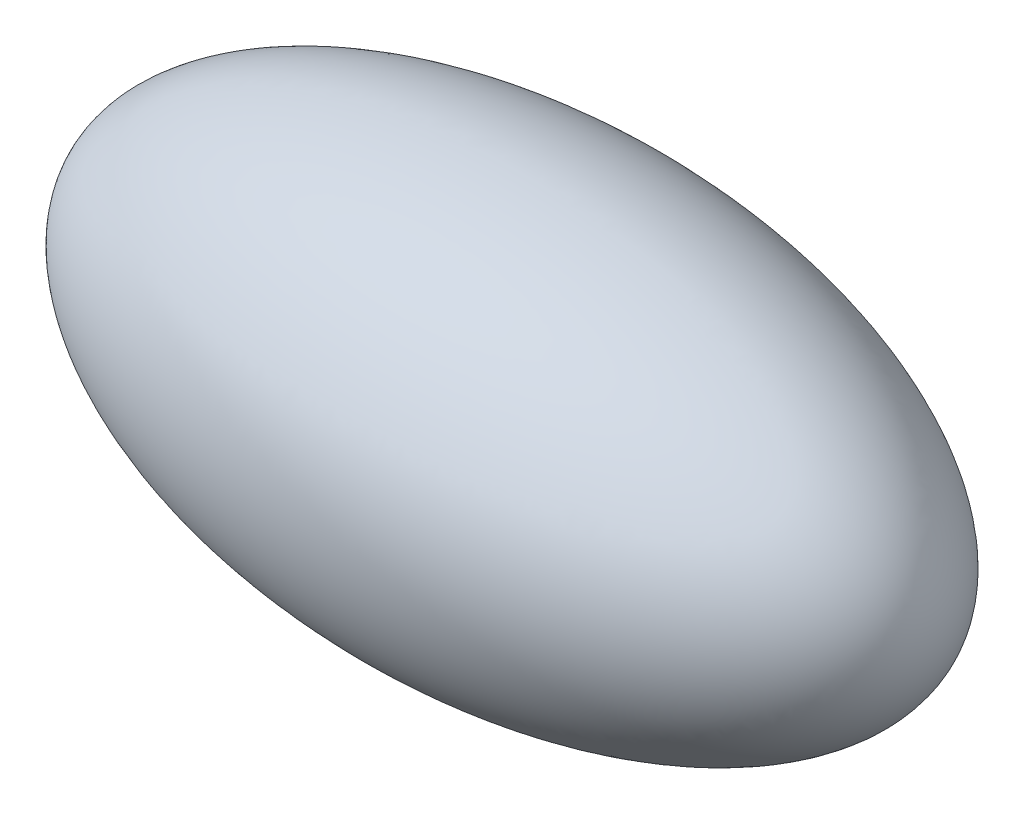
ISO-10303-21;
HEADER;
FILE_DESCRIPTION(('STEP AP214'),'2;1');
FILE_NAME('part.step','',(''),(''),'','','');
FILE_SCHEMA(('AUTOMOTIVE_DESIGN { 1 0 10303 214 1 1 1 1 }'));
ENDSEC;
DATA;
#1=APPLICATION_CONTEXT('core data for automotive mechanical design processes');
#2=APPLICATION_PROTOCOL_DEFINITION('international standard','automotive_design',2000,#1);
#3=PRODUCT_CONTEXT('',#1,'mechanical');
#4=PRODUCT('Part','Part','',(#3));
#5=PRODUCT_RELATED_PRODUCT_CATEGORY('part','',(#4));
#6=PRODUCT_DEFINITION_FORMATION('','',#4);
#7=PRODUCT_DEFINITION_CONTEXT('part definition',#1,'design');
#8=PRODUCT_DEFINITION('design','',#6,#7);
#9=PRODUCT_DEFINITION_SHAPE('','',#8);
#10=(LENGTH_UNIT() NAMED_UNIT(*) SI_UNIT(.MILLI.,.METRE.));
#11=(NAMED_UNIT(*) PLANE_ANGLE_UNIT() SI_UNIT($,.RADIAN.));
#12=(NAMED_UNIT(*) SI_UNIT($,.STERADIAN.) SOLID_ANGLE_UNIT());
#13=UNCERTAINTY_MEASURE_WITH_UNIT(LENGTH_MEASURE(1.E-05),#10,'distance_accuracy_value','');
#14=(GEOMETRIC_REPRESENTATION_CONTEXT(3) GLOBAL_UNCERTAINTY_ASSIGNED_CONTEXT((#13)) GLOBAL_UNIT_ASSIGNED_CONTEXT((#10,
#11,#12)) REPRESENTATION_CONTEXT('',''));
#15=CARTESIAN_POINT('',(0.,0.,0.));
#16=DIRECTION('',(0.,0.,1.));
#17=DIRECTION('',(1.,0.,0.));
#18=AXIS2_PLACEMENT_3D('',#15,#16,#17);
#19=CARTESIAN_POINT('',(0.,25.,0.));
#20=DIRECTION('',(0.,0.,1.));
#21=DIRECTION('',(1.,0.,0.));
#22=AXIS2_PLACEMENT_3D('',#19,#20,#21);
#23=ELLIPSE('',#22,50.,25.);
#24=TRIMMED_CURVE('',#23,(PARAMETER_VALUE(3.14159265358979)),
(PARAMETER_VALUE(6.28318530717959)),.T.,.PARAMETER.);
#25=CARTESIAN_POINT('',(-50.,25.,0.));
#26=DIRECTION('',(-1.,0.,0.));
#27=AXIS1_PLACEMENT('',#25,#26);
#28=SURFACE_OF_REVOLUTION('',#24,#27);
#29=CARTESIAN_POINT('',(50.,25.,0.));
#30=VERTEX_POINT('',#29);
#31=VERTEX_LOOP('',#30);
#32=FACE_BOUND('',#31,.T.);
#33=CARTESIAN_POINT('',(-50.,25.,0.));
#34=VERTEX_POINT('',#33);
#35=VERTEX_LOOP('',#34);
#36=FACE_BOUND('',#35,.T.);
#37=ADVANCED_FACE('F36',(#32,#36),#28,.F.);
#38=CLOSED_SHELL('',(#37));
#39=MANIFOLD_SOLID_BREP('B2',#38);
#40=ADVANCED_BREP_SHAPE_REPRESENTATION('',(#18,#39),#14);
#41=SHAPE_DEFINITION_REPRESENTATION(#9,#40);
ENDSEC;
END-ISO-10303-21;
